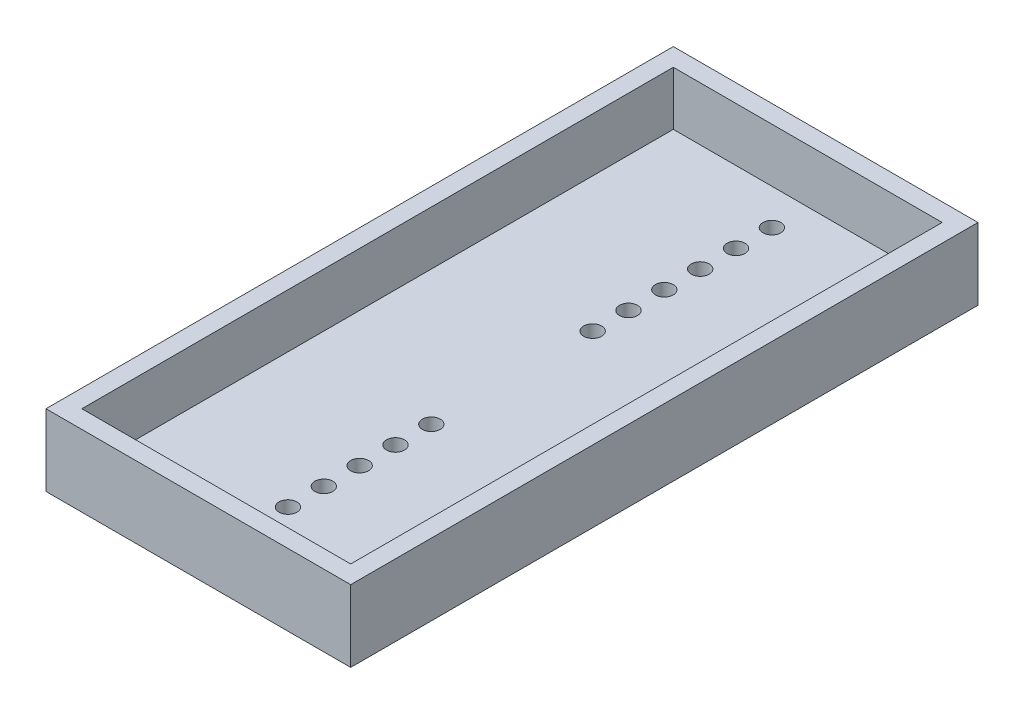
ISO-10303-21;
HEADER;
FILE_DESCRIPTION(('STEP AP214'),'2;1');
FILE_NAME('part.step','',(''),(''),'','','');
FILE_SCHEMA(('AUTOMOTIVE_DESIGN { 1 0 10303 214 1 1 1 1 }'));
ENDSEC;
DATA;
#1=APPLICATION_CONTEXT('core data for automotive mechanical design processes');
#2=APPLICATION_PROTOCOL_DEFINITION('international standard','automotive_design',2000,#1);
#3=PRODUCT_CONTEXT('',#1,'mechanical');
#4=PRODUCT('Part','Part','',(#3));
#5=PRODUCT_RELATED_PRODUCT_CATEGORY('part','',(#4));
#6=PRODUCT_DEFINITION_FORMATION('','',#4);
#7=PRODUCT_DEFINITION_CONTEXT('part definition',#1,'design');
#8=PRODUCT_DEFINITION('design','',#6,#7);
#9=PRODUCT_DEFINITION_SHAPE('','',#8);
#10=(LENGTH_UNIT() NAMED_UNIT(*) SI_UNIT(.MILLI.,.METRE.));
#11=(NAMED_UNIT(*) PLANE_ANGLE_UNIT() SI_UNIT($,.RADIAN.));
#12=(NAMED_UNIT(*) SI_UNIT($,.STERADIAN.) SOLID_ANGLE_UNIT());
#13=UNCERTAINTY_MEASURE_WITH_UNIT(LENGTH_MEASURE(1.E-05),#10,'distance_accuracy_value','');
#14=(GEOMETRIC_REPRESENTATION_CONTEXT(3) GLOBAL_UNCERTAINTY_ASSIGNED_CONTEXT((#13)) GLOBAL_UNIT_ASSIGNED_CONTEXT((#10,
#11,#12)) REPRESENTATION_CONTEXT('',''));
#15=CARTESIAN_POINT('',(0.,0.,0.));
#16=DIRECTION('',(0.,0.,1.));
#17=DIRECTION('',(1.,0.,0.));
#18=AXIS2_PLACEMENT_3D('',#15,#16,#17);
#19=CARTESIAN_POINT('',(0.,4.,0.));
#20=DIRECTION('',(0.,1.,0.));
#21=DIRECTION('',(0.,0.,1.));
#22=AXIS2_PLACEMENT_3D('',#19,#20,#21);
#23=PLANE('',#22);
#24=DIRECTION('',(0.,0.,1.));
#25=VECTOR('',#24,1.);
#26=CARTESIAN_POINT('',(-8.5,4.,-17.5));
#27=LINE('',#26,#25);
#28=CARTESIAN_POINT('',(-8.5,4.,-17.5));
#29=VERTEX_POINT('',#28);
#30=CARTESIAN_POINT('',(-8.5,4.,17.5));
#31=VERTEX_POINT('',#30);
#32=EDGE_CURVE('E142',#29,#31,#27,.T.);
#33=ORIENTED_EDGE('',*,*,#32,.T.);
#34=DIRECTION('',(1.,0.,0.));
#35=VECTOR('',#34,1.);
#36=CARTESIAN_POINT('',(-8.5,4.,17.5));
#37=LINE('',#36,#35);
#38=CARTESIAN_POINT('',(8.5,4.,17.5));
#39=VERTEX_POINT('',#38);
#40=EDGE_CURVE('E145',#31,#39,#37,.T.);
#41=ORIENTED_EDGE('',*,*,#40,.T.);
#42=DIRECTION('',(0.,0.,-1.));
#43=VECTOR('',#42,1.);
#44=CARTESIAN_POINT('',(8.5,4.,-17.5));
#45=LINE('',#44,#43);
#46=CARTESIAN_POINT('',(8.5,4.,-17.5));
#47=VERTEX_POINT('',#46);
#48=EDGE_CURVE('E148',#39,#47,#45,.T.);
#49=ORIENTED_EDGE('',*,*,#48,.T.);
#50=DIRECTION('',(-1.,0.,0.));
#51=VECTOR('',#50,1.);
#52=CARTESIAN_POINT('',(-8.5,4.,-17.5));
#53=LINE('',#52,#51);
#54=EDGE_CURVE('E150',#47,#29,#53,.T.);
#55=ORIENTED_EDGE('',*,*,#54,.T.);
#56=EDGE_LOOP('',(#33,#41,#49,#55));
#57=FACE_BOUND('',#56,.T.);
#58=DIRECTION('',(-1.,0.,0.));
#59=VECTOR('',#58,1.);
#60=CARTESIAN_POINT('',(-7.5,4.,-16.5));
#61=LINE('',#60,#59);
#62=CARTESIAN_POINT('',(7.5,4.,-16.5));
#63=VERTEX_POINT('',#62);
#64=CARTESIAN_POINT('',(-7.5,4.,-16.5));
#65=VERTEX_POINT('',#64);
#66=EDGE_CURVE('E127',#63,#65,#61,.T.);
#67=ORIENTED_EDGE('',*,*,#66,.F.);
#68=DIRECTION('',(0.,0.,-1.));
#69=VECTOR('',#68,1.);
#70=CARTESIAN_POINT('',(7.5,4.,-16.5));
#71=LINE('',#70,#69);
#72=CARTESIAN_POINT('',(7.5,4.,16.5));
#73=VERTEX_POINT('',#72);
#74=EDGE_CURVE('E125',#73,#63,#71,.T.);
#75=ORIENTED_EDGE('',*,*,#74,.F.);
#76=DIRECTION('',(1.,0.,0.));
#77=VECTOR('',#76,1.);
#78=CARTESIAN_POINT('',(-7.5,4.,16.5));
#79=LINE('',#78,#77);
#80=CARTESIAN_POINT('',(-7.5,4.,16.5));
#81=VERTEX_POINT('',#80);
#82=EDGE_CURVE('E112',#81,#73,#79,.T.);
#83=ORIENTED_EDGE('',*,*,#82,.F.);
#84=DIRECTION('',(0.,0.,1.));
#85=VECTOR('',#84,1.);
#86=CARTESIAN_POINT('',(-7.5,4.,-16.5));
#87=LINE('',#86,#85);
#88=EDGE_CURVE('E133',#65,#81,#87,.T.);
#89=ORIENTED_EDGE('',*,*,#88,.F.);
#90=EDGE_LOOP('',(#67,#75,#83,#89));
#91=FACE_BOUND('',#90,.T.);
#92=ADVANCED_FACE('F37',(#57,#91),#23,.T.);
#93=CARTESIAN_POINT('',(0.,0.,0.));
#94=DIRECTION('',(0.,1.,0.));
#95=DIRECTION('',(0.,0.,1.));
#96=AXIS2_PLACEMENT_3D('',#93,#94,#95);
#97=PLANE('',#96);
#98=CARTESIAN_POINT('',(0.,0.,-14.5));
#99=DIRECTION('',(0.,-1.,0.));
#100=DIRECTION('',(0.,0.,1.));
#101=AXIS2_PLACEMENT_3D('',#98,#99,#100);
#102=CIRCLE('',#101,0.5);
#103=CARTESIAN_POINT('',(0.,0.,-14.));
#104=VERTEX_POINT('',#103);
#105=EDGE_CURVE('E217',#104,#104,#102,.T.);
#106=ORIENTED_EDGE('',*,*,#105,.F.);
#107=EDGE_LOOP('',(#106));
#108=FACE_BOUND('',#107,.T.);
#109=CARTESIAN_POINT('',(0.,0.,-12.5));
#110=DIRECTION('',(0.,-1.,0.));
#111=DIRECTION('',(0.,0.,1.));
#112=AXIS2_PLACEMENT_3D('',#109,#110,#111);
#113=CIRCLE('',#112,0.5);
#114=CARTESIAN_POINT('',(0.,0.,-12.));
#115=VERTEX_POINT('',#114);
#116=EDGE_CURVE('E207',#115,#115,#113,.T.);
#117=ORIENTED_EDGE('',*,*,#116,.F.);
#118=EDGE_LOOP('',(#117));
#119=FACE_BOUND('',#118,.T.);
#120=CARTESIAN_POINT('',(0.,0.,-10.5));
#121=DIRECTION('',(0.,-1.,0.));
#122=DIRECTION('',(0.,0.,1.));
#123=AXIS2_PLACEMENT_3D('',#120,#121,#122);
#124=CIRCLE('',#123,0.5);
#125=CARTESIAN_POINT('',(0.,0.,-10.));
#126=VERTEX_POINT('',#125);
#127=EDGE_CURVE('E204',#126,#126,#124,.T.);
#128=ORIENTED_EDGE('',*,*,#127,.F.);
#129=EDGE_LOOP('',(#128));
#130=FACE_BOUND('',#129,.T.);
#131=CARTESIAN_POINT('',(0.,0.,-8.5));
#132=DIRECTION('',(0.,-1.,0.));
#133=DIRECTION('',(0.,0.,1.));
#134=AXIS2_PLACEMENT_3D('',#131,#132,#133);
#135=CIRCLE('',#134,0.5);
#136=CARTESIAN_POINT('',(0.,0.,-8.));
#137=VERTEX_POINT('',#136);
#138=EDGE_CURVE('E201',#137,#137,#135,.T.);
#139=ORIENTED_EDGE('',*,*,#138,.F.);
#140=EDGE_LOOP('',(#139));
#141=FACE_BOUND('',#140,.T.);
#142=CARTESIAN_POINT('',(1.12523471796816E-13,0.,-6.5));
#143=DIRECTION('',(0.,-1.,0.));
#144=DIRECTION('',(0.,0.,1.));
#145=AXIS2_PLACEMENT_3D('',#142,#143,#144);
#146=CIRCLE('',#145,0.5);
#147=CARTESIAN_POINT('',(1.12523471796816E-13,0.,-6.));
#148=VERTEX_POINT('',#147);
#149=EDGE_CURVE('E197',#148,#148,#146,.T.);
#150=ORIENTED_EDGE('',*,*,#149,.F.);
#151=EDGE_LOOP('',(#150));
#152=FACE_BOUND('',#151,.T.);
#153=CARTESIAN_POINT('',(1.40577799321073E-13,0.,-4.5));
#154=DIRECTION('',(0.,-1.,0.));
#155=DIRECTION('',(0.,0.,1.));
#156=AXIS2_PLACEMENT_3D('',#153,#154,#155);
#157=CIRCLE('',#156,0.5);
#158=CARTESIAN_POINT('',(1.40577799321073E-13,0.,-4.));
#159=VERTEX_POINT('',#158);
#160=EDGE_CURVE('E193',#159,#159,#157,.T.);
#161=ORIENTED_EDGE('',*,*,#160,.F.);
#162=EDGE_LOOP('',(#161));
#163=FACE_BOUND('',#162,.T.);
#164=CARTESIAN_POINT('',(1.40577799321073E-13,0.,4.5));
#165=DIRECTION('',(0.,-1.,0.));
#166=DIRECTION('',(0.,0.,-1.));
#167=AXIS2_PLACEMENT_3D('',#164,#165,#166);
#168=CIRCLE('',#167,0.5);
#169=CARTESIAN_POINT('',(1.40577799321073E-13,0.,4.));
#170=VERTEX_POINT('',#169);
#171=EDGE_CURVE('E189',#170,#170,#168,.T.);
#172=ORIENTED_EDGE('',*,*,#171,.F.);
#173=EDGE_LOOP('',(#172));
#174=FACE_BOUND('',#173,.T.);
#175=CARTESIAN_POINT('',(1.12523471796816E-13,0.,6.5));
#176=DIRECTION('',(0.,-1.,0.));
#177=DIRECTION('',(0.,0.,-1.));
#178=AXIS2_PLACEMENT_3D('',#175,#176,#177);
#179=CIRCLE('',#178,0.5);
#180=CARTESIAN_POINT('',(1.12523471796816E-13,0.,6.));
#181=VERTEX_POINT('',#180);
#182=EDGE_CURVE('E185',#181,#181,#179,.T.);
#183=ORIENTED_EDGE('',*,*,#182,.F.);
#184=EDGE_LOOP('',(#183));
#185=FACE_BOUND('',#184,.T.);
#186=CARTESIAN_POINT('',(0.,0.,8.5));
#187=DIRECTION('',(0.,-1.,0.));
#188=DIRECTION('',(0.,0.,-1.));
#189=AXIS2_PLACEMENT_3D('',#186,#187,#188);
#190=CIRCLE('',#189,0.5);
#191=CARTESIAN_POINT('',(0.,0.,8.));
#192=VERTEX_POINT('',#191);
#193=EDGE_CURVE('E181',#192,#192,#190,.T.);
#194=ORIENTED_EDGE('',*,*,#193,.F.);
#195=EDGE_LOOP('',(#194));
#196=FACE_BOUND('',#195,.T.);
#197=CARTESIAN_POINT('',(0.,0.,10.5));
#198=DIRECTION('',(0.,-1.,0.));
#199=DIRECTION('',(0.,0.,-1.));
#200=AXIS2_PLACEMENT_3D('',#197,#198,#199);
#201=CIRCLE('',#200,0.5);
#202=CARTESIAN_POINT('',(0.,0.,10.));
#203=VERTEX_POINT('',#202);
#204=EDGE_CURVE('E177',#203,#203,#201,.T.);
#205=ORIENTED_EDGE('',*,*,#204,.F.);
#206=EDGE_LOOP('',(#205));
#207=FACE_BOUND('',#206,.T.);
#208=CARTESIAN_POINT('',(0.,0.,12.5));
#209=DIRECTION('',(0.,-1.,0.));
#210=DIRECTION('',(0.,0.,-1.));
#211=AXIS2_PLACEMENT_3D('',#208,#209,#210);
#212=CIRCLE('',#211,0.5);
#213=CARTESIAN_POINT('',(0.,0.,12.));
#214=VERTEX_POINT('',#213);
#215=EDGE_CURVE('E173',#214,#214,#212,.T.);
#216=ORIENTED_EDGE('',*,*,#215,.F.);
#217=EDGE_LOOP('',(#216));
#218=FACE_BOUND('',#217,.T.);
#219=CARTESIAN_POINT('',(0.,0.,14.5));
#220=DIRECTION('',(0.,-1.,0.));
#221=DIRECTION('',(0.,0.,-1.));
#222=AXIS2_PLACEMENT_3D('',#219,#220,#221);
#223=CIRCLE('',#222,0.5);
#224=CARTESIAN_POINT('',(0.,0.,14.));
#225=VERTEX_POINT('',#224);
#226=EDGE_CURVE('E169',#225,#225,#223,.T.);
#227=ORIENTED_EDGE('',*,*,#226,.F.);
#228=EDGE_LOOP('',(#227));
#229=FACE_BOUND('',#228,.T.);
#230=DIRECTION('',(0.,0.,1.));
#231=VECTOR('',#230,1.);
#232=CARTESIAN_POINT('',(-8.5,0.,-17.5));
#233=LINE('',#232,#231);
#234=CARTESIAN_POINT('',(-8.5,0.,-17.5));
#235=VERTEX_POINT('',#234);
#236=CARTESIAN_POINT('',(-8.5,0.,17.5));
#237=VERTEX_POINT('',#236);
#238=EDGE_CURVE('E141',#235,#237,#233,.T.);
#239=ORIENTED_EDGE('',*,*,#238,.F.);
#240=DIRECTION('',(-1.,0.,0.));
#241=VECTOR('',#240,1.);
#242=CARTESIAN_POINT('',(-8.5,0.,-17.5));
#243=LINE('',#242,#241);
#244=CARTESIAN_POINT('',(8.5,0.,-17.5));
#245=VERTEX_POINT('',#244);
#246=EDGE_CURVE('E146',#245,#235,#243,.T.);
#247=ORIENTED_EDGE('',*,*,#246,.F.);
#248=DIRECTION('',(0.,0.,-1.));
#249=VECTOR('',#248,1.);
#250=CARTESIAN_POINT('',(8.5,0.,-17.5));
#251=LINE('',#250,#249);
#252=CARTESIAN_POINT('',(8.5,0.,17.5));
#253=VERTEX_POINT('',#252);
#254=EDGE_CURVE('E157',#253,#245,#251,.T.);
#255=ORIENTED_EDGE('',*,*,#254,.F.);
#256=DIRECTION('',(1.,0.,0.));
#257=VECTOR('',#256,1.);
#258=CARTESIAN_POINT('',(-8.5,0.,17.5));
#259=LINE('',#258,#257);
#260=EDGE_CURVE('E155',#237,#253,#259,.T.);
#261=ORIENTED_EDGE('',*,*,#260,.F.);
#262=EDGE_LOOP('',(#239,#247,#255,#261));
#263=FACE_BOUND('',#262,.T.);
#264=ADVANCED_FACE('F241',(#108,#119,#130,#141,#152,#163,#174,#185,#196,#207,#218,#229,#263),
#97,.F.);
#265=CARTESIAN_POINT('',(-8.5,4.,-17.5));
#266=DIRECTION('',(1.,0.,0.));
#267=DIRECTION('',(0.,0.,-1.));
#268=AXIS2_PLACEMENT_3D('',#265,#266,#267);
#269=PLANE('',#268);
#270=ORIENTED_EDGE('',*,*,#238,.T.);
#271=DIRECTION('',(0.,-1.,0.));
#272=VECTOR('',#271,1.);
#273=CARTESIAN_POINT('',(-8.5,4.,17.5));
#274=LINE('',#273,#272);
#275=EDGE_CURVE('E11',#31,#237,#274,.T.);
#276=ORIENTED_EDGE('',*,*,#275,.F.);
#277=ORIENTED_EDGE('',*,*,#32,.F.);
#278=DIRECTION('',(0.,-1.,0.));
#279=VECTOR('',#278,1.);
#280=CARTESIAN_POINT('',(-8.5,4.,-17.5));
#281=LINE('',#280,#279);
#282=EDGE_CURVE('E152',#29,#235,#281,.T.);
#283=ORIENTED_EDGE('',*,*,#282,.T.);
#284=EDGE_LOOP('',(#270,#276,#277,#283));
#285=FACE_BOUND('',#284,.T.);
#286=ADVANCED_FACE('F39',(#285),#269,.F.);
#287=CARTESIAN_POINT('',(-8.5,4.,17.5));
#288=DIRECTION('',(0.,0.,-1.));
#289=DIRECTION('',(-1.,0.,0.));
#290=AXIS2_PLACEMENT_3D('',#287,#288,#289);
#291=PLANE('',#290);
#292=ORIENTED_EDGE('',*,*,#260,.T.);
#293=DIRECTION('',(0.,-1.,0.));
#294=VECTOR('',#293,1.);
#295=CARTESIAN_POINT('',(8.5,4.,17.5));
#296=LINE('',#295,#294);
#297=EDGE_CURVE('E46',#39,#253,#296,.T.);
#298=ORIENTED_EDGE('',*,*,#297,.F.);
#299=ORIENTED_EDGE('',*,*,#40,.F.);
#300=ORIENTED_EDGE('',*,*,#275,.T.);
#301=EDGE_LOOP('',(#292,#298,#299,#300));
#302=FACE_BOUND('',#301,.T.);
#303=ADVANCED_FACE('F262',(#302),#291,.F.);
#304=CARTESIAN_POINT('',(8.5,4.,-17.5));
#305=DIRECTION('',(-1.,0.,0.));
#306=DIRECTION('',(0.,0.,1.));
#307=AXIS2_PLACEMENT_3D('',#304,#305,#306);
#308=PLANE('',#307);
#309=ORIENTED_EDGE('',*,*,#254,.T.);
#310=DIRECTION('',(0.,-1.,0.));
#311=VECTOR('',#310,1.);
#312=CARTESIAN_POINT('',(8.5,4.,-17.5));
#313=LINE('',#312,#311);
#314=EDGE_CURVE('E162',#47,#245,#313,.T.);
#315=ORIENTED_EDGE('',*,*,#314,.F.);
#316=ORIENTED_EDGE('',*,*,#48,.F.);
#317=ORIENTED_EDGE('',*,*,#297,.T.);
#318=EDGE_LOOP('',(#309,#315,#316,#317));
#319=FACE_BOUND('',#318,.T.);
#320=ADVANCED_FACE('F259',(#319),#308,.F.);
#321=CARTESIAN_POINT('',(-8.5,4.,-17.5));
#322=DIRECTION('',(0.,0.,1.));
#323=DIRECTION('',(1.,0.,0.));
#324=AXIS2_PLACEMENT_3D('',#321,#322,#323);
#325=PLANE('',#324);
#326=ORIENTED_EDGE('',*,*,#246,.T.);
#327=ORIENTED_EDGE('',*,*,#282,.F.);
#328=ORIENTED_EDGE('',*,*,#54,.F.);
#329=ORIENTED_EDGE('',*,*,#314,.T.);
#330=EDGE_LOOP('',(#326,#327,#328,#329));
#331=FACE_BOUND('',#330,.T.);
#332=ADVANCED_FACE('F255',(#331),#325,.F.);
#333=CARTESIAN_POINT('',(7.5,4.,-16.5));
#334=DIRECTION('',(-1.,0.,0.));
#335=DIRECTION('',(0.,0.,1.));
#336=AXIS2_PLACEMENT_3D('',#333,#334,#335);
#337=PLANE('',#336);
#338=DIRECTION('',(0.,0.,1.));
#339=VECTOR('',#338,1.);
#340=CARTESIAN_POINT('',(7.5,1.,0.));
#341=LINE('',#340,#339);
#342=CARTESIAN_POINT('',(7.5,1.,-16.5));
#343=VERTEX_POINT('',#342);
#344=CARTESIAN_POINT('',(7.5,1.,16.5));
#345=VERTEX_POINT('',#344);
#346=EDGE_CURVE('E118',#343,#345,#341,.T.);
#347=ORIENTED_EDGE('',*,*,#346,.T.);
#348=DIRECTION('',(0.,-1.,0.));
#349=VECTOR('',#348,1.);
#350=CARTESIAN_POINT('',(7.5,4.,16.5));
#351=LINE('',#350,#349);
#352=EDGE_CURVE('E106',#73,#345,#351,.T.);
#353=ORIENTED_EDGE('',*,*,#352,.F.);
#354=ORIENTED_EDGE('',*,*,#74,.T.);
#355=DIRECTION('',(0.,-1.,0.));
#356=VECTOR('',#355,1.);
#357=CARTESIAN_POINT('',(7.5,4.,-16.5));
#358=LINE('',#357,#356);
#359=EDGE_CURVE('E120',#63,#343,#358,.T.);
#360=ORIENTED_EDGE('',*,*,#359,.T.);
#361=EDGE_LOOP('',(#347,#353,#354,#360));
#362=FACE_BOUND('',#361,.T.);
#363=ADVANCED_FACE('F119',(#362),#337,.T.);
#364=CARTESIAN_POINT('',(-7.5,4.,-16.5));
#365=DIRECTION('',(0.,0.,1.));
#366=DIRECTION('',(1.,0.,0.));
#367=AXIS2_PLACEMENT_3D('',#364,#365,#366);
#368=PLANE('',#367);
#369=DIRECTION('',(1.,0.,0.));
#370=VECTOR('',#369,1.);
#371=CARTESIAN_POINT('',(0.,1.,-16.5));
#372=LINE('',#371,#370);
#373=CARTESIAN_POINT('',(-7.5,1.,-16.5));
#374=VERTEX_POINT('',#373);
#375=EDGE_CURVE('E54',#374,#343,#372,.T.);
#376=ORIENTED_EDGE('',*,*,#375,.T.);
#377=ORIENTED_EDGE('',*,*,#359,.F.);
#378=ORIENTED_EDGE('',*,*,#66,.T.);
#379=DIRECTION('',(0.,-1.,0.));
#380=VECTOR('',#379,1.);
#381=CARTESIAN_POINT('',(-7.5,4.,-16.5));
#382=LINE('',#381,#380);
#383=EDGE_CURVE('E138',#65,#374,#382,.T.);
#384=ORIENTED_EDGE('',*,*,#383,.T.);
#385=EDGE_LOOP('',(#376,#377,#378,#384));
#386=FACE_BOUND('',#385,.T.);
#387=ADVANCED_FACE('F269',(#386),#368,.T.);
#388=CARTESIAN_POINT('',(-7.5,4.,-16.5));
#389=DIRECTION('',(1.,0.,0.));
#390=DIRECTION('',(0.,0.,-1.));
#391=AXIS2_PLACEMENT_3D('',#388,#389,#390);
#392=PLANE('',#391);
#393=DIRECTION('',(0.,0.,1.));
#394=VECTOR('',#393,1.);
#395=CARTESIAN_POINT('',(-7.5,1.,0.));
#396=LINE('',#395,#394);
#397=CARTESIAN_POINT('',(-7.5,1.,16.5));
#398=VERTEX_POINT('',#397);
#399=EDGE_CURVE('E62',#374,#398,#396,.T.);
#400=ORIENTED_EDGE('',*,*,#399,.F.);
#401=ORIENTED_EDGE('',*,*,#383,.F.);
#402=ORIENTED_EDGE('',*,*,#88,.T.);
#403=DIRECTION('',(0.,-1.,0.));
#404=VECTOR('',#403,1.);
#405=CARTESIAN_POINT('',(-7.5,4.,16.5));
#406=LINE('',#405,#404);
#407=EDGE_CURVE('E115',#81,#398,#406,.T.);
#408=ORIENTED_EDGE('',*,*,#407,.T.);
#409=EDGE_LOOP('',(#400,#401,#402,#408));
#410=FACE_BOUND('',#409,.T.);
#411=ADVANCED_FACE('F270',(#410),#392,.T.);
#412=CARTESIAN_POINT('',(-7.5,4.,16.5));
#413=DIRECTION('',(0.,0.,-1.));
#414=DIRECTION('',(-1.,0.,0.));
#415=AXIS2_PLACEMENT_3D('',#412,#413,#414);
#416=PLANE('',#415);
#417=DIRECTION('',(1.,0.,0.));
#418=VECTOR('',#417,1.);
#419=CARTESIAN_POINT('',(0.,1.,16.5));
#420=LINE('',#419,#418);
#421=EDGE_CURVE('E110',#398,#345,#420,.T.);
#422=ORIENTED_EDGE('',*,*,#421,.F.);
#423=ORIENTED_EDGE('',*,*,#407,.F.);
#424=ORIENTED_EDGE('',*,*,#82,.T.);
#425=ORIENTED_EDGE('',*,*,#352,.T.);
#426=EDGE_LOOP('',(#422,#423,#424,#425));
#427=FACE_BOUND('',#426,.T.);
#428=ADVANCED_FACE('F108',(#427),#416,.T.);
#429=CARTESIAN_POINT('',(0.,1.,0.));
#430=DIRECTION('',(0.,1.,0.));
#431=DIRECTION('',(0.,0.,1.));
#432=AXIS2_PLACEMENT_3D('',#429,#430,#431);
#433=PLANE('',#432);
#434=CARTESIAN_POINT('',(0.,1.,-14.5));
#435=DIRECTION('',(0.,1.,0.));
#436=DIRECTION('',(0.,0.,1.));
#437=AXIS2_PLACEMENT_3D('',#434,#435,#436);
#438=CIRCLE('',#437,0.5);
#439=CARTESIAN_POINT('',(0.,1.,-14.));
#440=VERTEX_POINT('',#439);
#441=EDGE_CURVE('E41',#440,#440,#438,.T.);
#442=ORIENTED_EDGE('',*,*,#441,.F.);
#443=EDGE_LOOP('',(#442));
#444=FACE_BOUND('',#443,.T.);
#445=CARTESIAN_POINT('',(0.,1.,-12.5));
#446=DIRECTION('',(0.,1.,0.));
#447=DIRECTION('',(0.,0.,1.));
#448=AXIS2_PLACEMENT_3D('',#445,#446,#447);
#449=CIRCLE('',#448,0.5);
#450=CARTESIAN_POINT('',(0.,1.,-12.));
#451=VERTEX_POINT('',#450);
#452=EDGE_CURVE('E205',#451,#451,#449,.T.);
#453=ORIENTED_EDGE('',*,*,#452,.F.);
#454=EDGE_LOOP('',(#453));
#455=FACE_BOUND('',#454,.T.);
#456=CARTESIAN_POINT('',(0.,1.,-10.5));
#457=DIRECTION('',(0.,1.,0.));
#458=DIRECTION('',(0.,0.,1.));
#459=AXIS2_PLACEMENT_3D('',#456,#457,#458);
#460=CIRCLE('',#459,0.5);
#461=CARTESIAN_POINT('',(0.,1.,-10.));
#462=VERTEX_POINT('',#461);
#463=EDGE_CURVE('E202',#462,#462,#460,.T.);
#464=ORIENTED_EDGE('',*,*,#463,.F.);
#465=EDGE_LOOP('',(#464));
#466=FACE_BOUND('',#465,.T.);
#467=CARTESIAN_POINT('',(0.,1.,-8.5));
#468=DIRECTION('',(0.,1.,0.));
#469=DIRECTION('',(0.,0.,1.));
#470=AXIS2_PLACEMENT_3D('',#467,#468,#469);
#471=CIRCLE('',#470,0.5);
#472=CARTESIAN_POINT('',(0.,1.,-8.));
#473=VERTEX_POINT('',#472);
#474=EDGE_CURVE('E198',#473,#473,#471,.T.);
#475=ORIENTED_EDGE('',*,*,#474,.F.);
#476=EDGE_LOOP('',(#475));
#477=FACE_BOUND('',#476,.T.);
#478=CARTESIAN_POINT('',(1.12523471796816E-13,1.,-6.5));
#479=DIRECTION('',(0.,1.,0.));
#480=DIRECTION('',(0.,0.,1.));
#481=AXIS2_PLACEMENT_3D('',#478,#479,#480);
#482=CIRCLE('',#481,0.5);
#483=CARTESIAN_POINT('',(1.12523471796816E-13,1.,-6.));
#484=VERTEX_POINT('',#483);
#485=EDGE_CURVE('E194',#484,#484,#482,.T.);
#486=ORIENTED_EDGE('',*,*,#485,.F.);
#487=EDGE_LOOP('',(#486));
#488=FACE_BOUND('',#487,.T.);
#489=CARTESIAN_POINT('',(1.40577799321073E-13,1.,-4.5));
#490=DIRECTION('',(0.,1.,0.));
#491=DIRECTION('',(0.,0.,1.));
#492=AXIS2_PLACEMENT_3D('',#489,#490,#491);
#493=CIRCLE('',#492,0.5);
#494=CARTESIAN_POINT('',(1.40577799321073E-13,1.,-4.));
#495=VERTEX_POINT('',#494);
#496=EDGE_CURVE('E190',#495,#495,#493,.T.);
#497=ORIENTED_EDGE('',*,*,#496,.F.);
#498=EDGE_LOOP('',(#497));
#499=FACE_BOUND('',#498,.T.);
#500=CARTESIAN_POINT('',(1.40577799321073E-13,1.,4.5));
#501=DIRECTION('',(0.,1.,0.));
#502=DIRECTION('',(0.,0.,1.));
#503=AXIS2_PLACEMENT_3D('',#500,#501,#502);
#504=CIRCLE('',#503,0.5);
#505=CARTESIAN_POINT('',(1.40577799321073E-13,1.,5.));
#506=VERTEX_POINT('',#505);
#507=EDGE_CURVE('E186',#506,#506,#504,.T.);
#508=ORIENTED_EDGE('',*,*,#507,.F.);
#509=EDGE_LOOP('',(#508));
#510=FACE_BOUND('',#509,.T.);
#511=CARTESIAN_POINT('',(1.12523471796816E-13,1.,6.5));
#512=DIRECTION('',(0.,1.,0.));
#513=DIRECTION('',(0.,0.,1.));
#514=AXIS2_PLACEMENT_3D('',#511,#512,#513);
#515=CIRCLE('',#514,0.5);
#516=CARTESIAN_POINT('',(1.12523471796816E-13,1.,7.));
#517=VERTEX_POINT('',#516);
#518=EDGE_CURVE('E182',#517,#517,#515,.T.);
#519=ORIENTED_EDGE('',*,*,#518,.F.);
#520=EDGE_LOOP('',(#519));
#521=FACE_BOUND('',#520,.T.);
#522=CARTESIAN_POINT('',(0.,1.,8.5));
#523=DIRECTION('',(0.,1.,0.));
#524=DIRECTION('',(0.,0.,1.));
#525=AXIS2_PLACEMENT_3D('',#522,#523,#524);
#526=CIRCLE('',#525,0.5);
#527=CARTESIAN_POINT('',(0.,1.,9.));
#528=VERTEX_POINT('',#527);
#529=EDGE_CURVE('E178',#528,#528,#526,.T.);
#530=ORIENTED_EDGE('',*,*,#529,.F.);
#531=EDGE_LOOP('',(#530));
#532=FACE_BOUND('',#531,.T.);
#533=CARTESIAN_POINT('',(0.,1.,10.5));
#534=DIRECTION('',(0.,1.,0.));
#535=DIRECTION('',(0.,0.,1.));
#536=AXIS2_PLACEMENT_3D('',#533,#534,#535);
#537=CIRCLE('',#536,0.5);
#538=CARTESIAN_POINT('',(0.,1.,11.));
#539=VERTEX_POINT('',#538);
#540=EDGE_CURVE('E174',#539,#539,#537,.T.);
#541=ORIENTED_EDGE('',*,*,#540,.F.);
#542=EDGE_LOOP('',(#541));
#543=FACE_BOUND('',#542,.T.);
#544=CARTESIAN_POINT('',(0.,1.,12.5));
#545=DIRECTION('',(0.,1.,0.));
#546=DIRECTION('',(0.,0.,1.));
#547=AXIS2_PLACEMENT_3D('',#544,#545,#546);
#548=CIRCLE('',#547,0.5);
#549=CARTESIAN_POINT('',(0.,1.,13.));
#550=VERTEX_POINT('',#549);
#551=EDGE_CURVE('E170',#550,#550,#548,.T.);
#552=ORIENTED_EDGE('',*,*,#551,.F.);
#553=EDGE_LOOP('',(#552));
#554=FACE_BOUND('',#553,.T.);
#555=CARTESIAN_POINT('',(0.,1.,14.5));
#556=DIRECTION('',(0.,1.,0.));
#557=DIRECTION('',(0.,0.,1.));
#558=AXIS2_PLACEMENT_3D('',#555,#556,#557);
#559=CIRCLE('',#558,0.5);
#560=CARTESIAN_POINT('',(0.,1.,15.));
#561=VERTEX_POINT('',#560);
#562=EDGE_CURVE('E122',#561,#561,#559,.T.);
#563=ORIENTED_EDGE('',*,*,#562,.F.);
#564=EDGE_LOOP('',(#563));
#565=FACE_BOUND('',#564,.T.);
#566=ORIENTED_EDGE('',*,*,#346,.F.);
#567=ORIENTED_EDGE('',*,*,#375,.F.);
#568=ORIENTED_EDGE('',*,*,#399,.T.);
#569=ORIENTED_EDGE('',*,*,#421,.T.);
#570=EDGE_LOOP('',(#566,#567,#568,#569));
#571=FACE_BOUND('',#570,.T.);
#572=ADVANCED_FACE('F124',(#444,#455,#466,#477,#488,#499,#510,#521,#532,#543,#554,#565,#571),
#433,.T.);
#573=CARTESIAN_POINT('',(0.,4.,14.5));
#574=DIRECTION('',(0.,-1.,0.));
#575=DIRECTION('',(0.,0.,-1.));
#576=AXIS2_PLACEMENT_3D('',#573,#574,#575);
#577=CYLINDRICAL_SURFACE('',#576,0.5);
#578=ORIENTED_EDGE('',*,*,#562,.T.);
#579=EDGE_LOOP('',(#578));
#580=FACE_BOUND('',#579,.T.);
#581=ORIENTED_EDGE('',*,*,#226,.T.);
#582=EDGE_LOOP('',(#581));
#583=FACE_BOUND('',#582,.T.);
#584=ADVANCED_FACE('F239',(#580,#583),#577,.F.);
#585=CARTESIAN_POINT('',(0.,4.,12.5));
#586=DIRECTION('',(0.,-1.,0.));
#587=DIRECTION('',(0.,0.,-1.));
#588=AXIS2_PLACEMENT_3D('',#585,#586,#587);
#589=CYLINDRICAL_SURFACE('',#588,0.5);
#590=ORIENTED_EDGE('',*,*,#551,.T.);
#591=EDGE_LOOP('',(#590));
#592=FACE_BOUND('',#591,.T.);
#593=ORIENTED_EDGE('',*,*,#215,.T.);
#594=EDGE_LOOP('',(#593));
#595=FACE_BOUND('',#594,.T.);
#596=ADVANCED_FACE('F355',(#592,#595),#589,.F.);
#597=CARTESIAN_POINT('',(0.,4.,10.5));
#598=DIRECTION('',(0.,-1.,0.));
#599=DIRECTION('',(0.,0.,-1.));
#600=AXIS2_PLACEMENT_3D('',#597,#598,#599);
#601=CYLINDRICAL_SURFACE('',#600,0.5);
#602=ORIENTED_EDGE('',*,*,#540,.T.);
#603=EDGE_LOOP('',(#602));
#604=FACE_BOUND('',#603,.T.);
#605=ORIENTED_EDGE('',*,*,#204,.T.);
#606=EDGE_LOOP('',(#605));
#607=FACE_BOUND('',#606,.T.);
#608=ADVANCED_FACE('F363',(#604,#607),#601,.F.);
#609=CARTESIAN_POINT('',(0.,4.,8.5));
#610=DIRECTION('',(0.,-1.,0.));
#611=DIRECTION('',(0.,0.,-1.));
#612=AXIS2_PLACEMENT_3D('',#609,#610,#611);
#613=CYLINDRICAL_SURFACE('',#612,0.5);
#614=ORIENTED_EDGE('',*,*,#529,.T.);
#615=EDGE_LOOP('',(#614));
#616=FACE_BOUND('',#615,.T.);
#617=ORIENTED_EDGE('',*,*,#193,.T.);
#618=EDGE_LOOP('',(#617));
#619=FACE_BOUND('',#618,.T.);
#620=ADVANCED_FACE('F371',(#616,#619),#613,.F.);
#621=CARTESIAN_POINT('',(1.12523471796816E-13,4.,6.5));
#622=DIRECTION('',(0.,-1.,0.));
#623=DIRECTION('',(0.,0.,-1.));
#624=AXIS2_PLACEMENT_3D('',#621,#622,#623);
#625=CYLINDRICAL_SURFACE('',#624,0.5);
#626=ORIENTED_EDGE('',*,*,#518,.T.);
#627=EDGE_LOOP('',(#626));
#628=FACE_BOUND('',#627,.T.);
#629=ORIENTED_EDGE('',*,*,#182,.T.);
#630=EDGE_LOOP('',(#629));
#631=FACE_BOUND('',#630,.T.);
#632=ADVANCED_FACE('F379',(#628,#631),#625,.F.);
#633=CARTESIAN_POINT('',(1.40577799321073E-13,4.,4.5));
#634=DIRECTION('',(0.,-1.,0.));
#635=DIRECTION('',(0.,0.,-1.));
#636=AXIS2_PLACEMENT_3D('',#633,#634,#635);
#637=CYLINDRICAL_SURFACE('',#636,0.5);
#638=ORIENTED_EDGE('',*,*,#507,.T.);
#639=EDGE_LOOP('',(#638));
#640=FACE_BOUND('',#639,.T.);
#641=ORIENTED_EDGE('',*,*,#171,.T.);
#642=EDGE_LOOP('',(#641));
#643=FACE_BOUND('',#642,.T.);
#644=ADVANCED_FACE('F387',(#640,#643),#637,.F.);
#645=CARTESIAN_POINT('',(1.40577799321073E-13,4.,-4.5));
#646=DIRECTION('',(0.,-1.,0.));
#647=DIRECTION('',(0.,0.,-1.));
#648=AXIS2_PLACEMENT_3D('',#645,#646,#647);
#649=CYLINDRICAL_SURFACE('',#648,0.5);
#650=ORIENTED_EDGE('',*,*,#496,.T.);
#651=EDGE_LOOP('',(#650));
#652=FACE_BOUND('',#651,.T.);
#653=ORIENTED_EDGE('',*,*,#160,.T.);
#654=EDGE_LOOP('',(#653));
#655=FACE_BOUND('',#654,.T.);
#656=ADVANCED_FACE('F395',(#652,#655),#649,.F.);
#657=CARTESIAN_POINT('',(1.12523471796816E-13,4.,-6.5));
#658=DIRECTION('',(0.,-1.,0.));
#659=DIRECTION('',(0.,0.,-1.));
#660=AXIS2_PLACEMENT_3D('',#657,#658,#659);
#661=CYLINDRICAL_SURFACE('',#660,0.5);
#662=ORIENTED_EDGE('',*,*,#485,.T.);
#663=EDGE_LOOP('',(#662));
#664=FACE_BOUND('',#663,.T.);
#665=ORIENTED_EDGE('',*,*,#149,.T.);
#666=EDGE_LOOP('',(#665));
#667=FACE_BOUND('',#666,.T.);
#668=ADVANCED_FACE('F403',(#664,#667),#661,.F.);
#669=CARTESIAN_POINT('',(0.,4.,-8.5));
#670=DIRECTION('',(0.,-1.,0.));
#671=DIRECTION('',(0.,0.,-1.));
#672=AXIS2_PLACEMENT_3D('',#669,#670,#671);
#673=CYLINDRICAL_SURFACE('',#672,0.5);
#674=ORIENTED_EDGE('',*,*,#474,.T.);
#675=EDGE_LOOP('',(#674));
#676=FACE_BOUND('',#675,.T.);
#677=ORIENTED_EDGE('',*,*,#138,.T.);
#678=EDGE_LOOP('',(#677));
#679=FACE_BOUND('',#678,.T.);
#680=ADVANCED_FACE('F411',(#676,#679),#673,.F.);
#681=CARTESIAN_POINT('',(0.,4.,-10.5));
#682=DIRECTION('',(0.,-1.,0.));
#683=DIRECTION('',(0.,0.,-1.));
#684=AXIS2_PLACEMENT_3D('',#681,#682,#683);
#685=CYLINDRICAL_SURFACE('',#684,0.5);
#686=ORIENTED_EDGE('',*,*,#463,.T.);
#687=EDGE_LOOP('',(#686));
#688=FACE_BOUND('',#687,.T.);
#689=ORIENTED_EDGE('',*,*,#127,.T.);
#690=EDGE_LOOP('',(#689));
#691=FACE_BOUND('',#690,.T.);
#692=ADVANCED_FACE('F419',(#688,#691),#685,.F.);
#693=CARTESIAN_POINT('',(0.,4.,-12.5));
#694=DIRECTION('',(0.,-1.,0.));
#695=DIRECTION('',(0.,0.,-1.));
#696=AXIS2_PLACEMENT_3D('',#693,#694,#695);
#697=CYLINDRICAL_SURFACE('',#696,0.5);
#698=ORIENTED_EDGE('',*,*,#452,.T.);
#699=EDGE_LOOP('',(#698));
#700=FACE_BOUND('',#699,.T.);
#701=ORIENTED_EDGE('',*,*,#116,.T.);
#702=EDGE_LOOP('',(#701));
#703=FACE_BOUND('',#702,.T.);
#704=ADVANCED_FACE('F427',(#700,#703),#697,.F.);
#705=CARTESIAN_POINT('',(0.,4.,-14.5));
#706=DIRECTION('',(0.,-1.,0.));
#707=DIRECTION('',(0.,0.,-1.));
#708=AXIS2_PLACEMENT_3D('',#705,#706,#707);
#709=CYLINDRICAL_SURFACE('',#708,0.5);
#710=ORIENTED_EDGE('',*,*,#441,.T.);
#711=EDGE_LOOP('',(#710));
#712=FACE_BOUND('',#711,.T.);
#713=ORIENTED_EDGE('',*,*,#105,.T.);
#714=EDGE_LOOP('',(#713));
#715=FACE_BOUND('',#714,.T.);
#716=ADVANCED_FACE('F435',(#712,#715),#709,.F.);
#717=CLOSED_SHELL('',(#92,#264,#286,#303,#320,#332,#363,#387,#411,#428,#572,#584,#596,#608,#620,
#632,#644,#656,#668,#680,#692,#704,#716));
#718=MANIFOLD_SOLID_BREP('B2',#717);
#719=ADVANCED_BREP_SHAPE_REPRESENTATION('',(#18,#718),#14);
#720=SHAPE_DEFINITION_REPRESENTATION(#9,#719);
ENDSEC;
END-ISO-10303-21;
